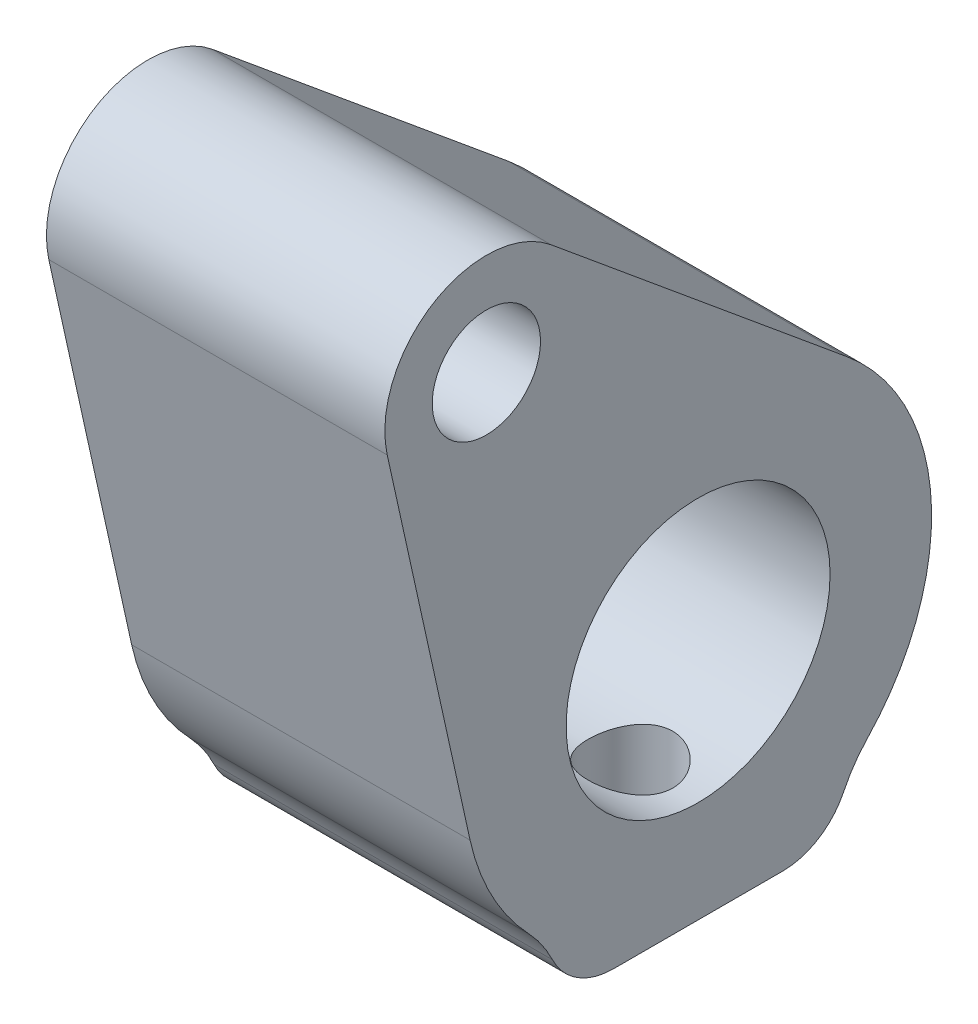
ISO-10303-21;
HEADER;
FILE_DESCRIPTION(('STEP AP214'),'2;1');
FILE_NAME('part.step','',(''),(''),'','','');
FILE_SCHEMA(('AUTOMOTIVE_DESIGN { 1 0 10303 214 1 1 1 1 }'));
ENDSEC;
DATA;
#1=APPLICATION_CONTEXT('core data for automotive mechanical design processes');
#2=APPLICATION_PROTOCOL_DEFINITION('international standard','automotive_design',2000,#1);
#3=PRODUCT_CONTEXT('',#1,'mechanical');
#4=PRODUCT('Part','Part','',(#3));
#5=PRODUCT_RELATED_PRODUCT_CATEGORY('part','',(#4));
#6=PRODUCT_DEFINITION_FORMATION('','',#4);
#7=PRODUCT_DEFINITION_CONTEXT('part definition',#1,'design');
#8=PRODUCT_DEFINITION('design','',#6,#7);
#9=PRODUCT_DEFINITION_SHAPE('','',#8);
#10=(LENGTH_UNIT() NAMED_UNIT(*) SI_UNIT(.MILLI.,.METRE.));
#11=(NAMED_UNIT(*) PLANE_ANGLE_UNIT() SI_UNIT($,.RADIAN.));
#12=(NAMED_UNIT(*) SI_UNIT($,.STERADIAN.) SOLID_ANGLE_UNIT());
#13=UNCERTAINTY_MEASURE_WITH_UNIT(LENGTH_MEASURE(1.E-05),#10,'distance_accuracy_value','');
#14=(GEOMETRIC_REPRESENTATION_CONTEXT(3) GLOBAL_UNCERTAINTY_ASSIGNED_CONTEXT((#13)) GLOBAL_UNIT_ASSIGNED_CONTEXT((#10,
#11,#12)) REPRESENTATION_CONTEXT('',''));
#15=CARTESIAN_POINT('',(0.,0.,0.));
#16=DIRECTION('',(0.,0.,1.));
#17=DIRECTION('',(1.,0.,0.));
#18=AXIS2_PLACEMENT_3D('',#15,#16,#17);
#19=CARTESIAN_POINT('',(4.,5.31578022126978,-4.39914544419221));
#20=DIRECTION('',(0.,0.770402930618808,-0.637557310752494));
#21=DIRECTION('',(0.,0.637557310752494,0.770402930618808));
#22=AXIS2_PLACEMENT_3D('',#19,#20,#21);
#23=PLANE('',#22);
#24=DIRECTION('',(-1.,0.,0.));
#25=VECTOR('',#24,1.);
#26=CARTESIAN_POINT('',(4.,5.31578022126979,-4.39914544419221));
#27=LINE('',#26,#25);
#28=CARTESIAN_POINT('',(4.,5.31578022126979,-4.39914544419221));
#29=VERTEX_POINT('',#28);
#30=CARTESIAN_POINT('',(-6.00000000000001,5.31578022126979,-4.39914544419221));
#31=VERTEX_POINT('',#30);
#32=EDGE_CURVE('E142',#29,#31,#27,.T.);
#33=ORIENTED_EDGE('',*,*,#32,.T.);
#34=DIRECTION('',(0.,-0.637557310752494,-0.770402930618808));
#35=VECTOR('',#34,1.);
#36=CARTESIAN_POINT('',(-6.00000000000001,5.31578022126978,-4.39914544419221));
#37=LINE('',#36,#35);
#38=CARTESIAN_POINT('',(-6.00000000000001,12.5511428384146,4.34382474896435));
#39=VERTEX_POINT('',#38);
#40=EDGE_CURVE('E137',#39,#31,#37,.T.);
#41=ORIENTED_EDGE('',*,*,#40,.F.);
#42=DIRECTION('',(-1.,0.,0.));
#43=VECTOR('',#42,1.);
#44=CARTESIAN_POINT('',(4.,12.5511428384146,4.34382474896435));
#45=LINE('',#44,#43);
#46=CARTESIAN_POINT('',(4.,12.5511428384146,4.34382474896435));
#47=VERTEX_POINT('',#46);
#48=EDGE_CURVE('E11',#47,#39,#45,.T.);
#49=ORIENTED_EDGE('',*,*,#48,.F.);
#50=DIRECTION('',(0.,-0.637557310752494,-0.770402930618808));
#51=VECTOR('',#50,1.);
#52=CARTESIAN_POINT('',(4.,5.31578022126978,-4.39914544419221));
#53=LINE('',#52,#51);
#54=EDGE_CURVE('E284',#47,#29,#53,.T.);
#55=ORIENTED_EDGE('',*,*,#54,.T.);
#56=EDGE_LOOP('',(#33,#41,#49,#55));
#57=FACE_BOUND('',#56,.T.);
#58=ADVANCED_FACE('F45',(#57),#23,.T.);
#59=CARTESIAN_POINT('',(4.,10.2399340465581,6.25649668122183));
#60=DIRECTION('',(-1.,0.,0.));
#61=DIRECTION('',(0.,0.,1.));
#62=AXIS2_PLACEMENT_3D('',#59,#60,#61);
#63=CYLINDRICAL_SURFACE('',#62,3.);
#64=ORIENTED_EDGE('',*,*,#48,.T.);
#65=CARTESIAN_POINT('',(-6.00000000000001,10.2399340465581,6.25649668122183));
#66=DIRECTION('',(1.,0.,0.));
#67=DIRECTION('',(0.,0.,-1.));
#68=AXIS2_PLACEMENT_3D('',#65,#66,#67);
#69=CIRCLE('',#68,3.);
#70=CARTESIAN_POINT('',(-6.00000000000001,9.59271453726741,9.18584932417786));
#71=VERTEX_POINT('',#70);
#72=EDGE_CURVE('E126',#39,#71,#69,.T.);
#73=ORIENTED_EDGE('',*,*,#72,.T.);
#74=DIRECTION('',(-1.,0.,0.));
#75=VECTOR('',#74,1.);
#76=CARTESIAN_POINT('',(4.,9.59271453726741,9.18584932417786));
#77=LINE('',#76,#75);
#78=CARTESIAN_POINT('',(4.,9.59271453726741,9.18584932417786));
#79=VERTEX_POINT('',#78);
#80=EDGE_CURVE('E53',#79,#71,#77,.T.);
#81=ORIENTED_EDGE('',*,*,#80,.F.);
#82=CARTESIAN_POINT('',(4.,10.2399340465581,6.25649668122183));
#83=DIRECTION('',(1.,0.,0.));
#84=DIRECTION('',(0.,0.,-1.));
#85=AXIS2_PLACEMENT_3D('',#82,#83,#84);
#86=CIRCLE('',#85,3.);
#87=EDGE_CURVE('E128',#47,#79,#86,.T.);
#88=ORIENTED_EDGE('',*,*,#87,.F.);
#89=EDGE_LOOP('',(#64,#73,#81,#88));
#90=FACE_BOUND('',#89,.T.);
#91=ADVANCED_FACE('F124',(#90),#63,.T.);
#92=CARTESIAN_POINT('',(4.,-1.48860487136868,6.73751107879886));
#93=DIRECTION('',(0.,0.215739836430243,-0.976450880985343));
#94=DIRECTION('',(0.,0.976450880985343,0.215739836430243));
#95=AXIS2_PLACEMENT_3D('',#92,#93,#94);
#96=PLANE('',#95);
#97=ORIENTED_EDGE('',*,*,#80,.T.);
#98=DIRECTION('',(0.,-0.976450880985343,-0.215739836430243));
#99=VECTOR('',#98,1.);
#100=CARTESIAN_POINT('',(-6.00000000000001,-1.48860487136868,6.73751107879886));
#101=LINE('',#100,#99);
#102=CARTESIAN_POINT('',(-6.00000000000001,-1.48860487136866,6.73751107879887));
#103=VERTEX_POINT('',#102);
#104=EDGE_CURVE('E140',#71,#103,#101,.T.);
#105=ORIENTED_EDGE('',*,*,#104,.T.);
#106=DIRECTION('',(-1.,0.,0.));
#107=VECTOR('',#106,1.);
#108=CARTESIAN_POINT('',(4.,-1.48860487136866,6.73751107879887));
#109=LINE('',#108,#107);
#110=CARTESIAN_POINT('',(4.,-1.48860487136866,6.73751107879887));
#111=VERTEX_POINT('',#110);
#112=EDGE_CURVE('E278',#111,#103,#109,.T.);
#113=ORIENTED_EDGE('',*,*,#112,.F.);
#114=DIRECTION('',(0.,-0.976450880985343,-0.215739836430243));
#115=VECTOR('',#114,1.);
#116=CARTESIAN_POINT('',(4.,-1.48860487136868,6.73751107879886));
#117=LINE('',#116,#115);
#118=EDGE_CURVE('E281',#79,#111,#117,.T.);
#119=ORIENTED_EDGE('',*,*,#118,.F.);
#120=EDGE_LOOP('',(#97,#105,#113,#119));
#121=FACE_BOUND('',#120,.T.);
#122=ADVANCED_FACE('F226',(#121),#96,.F.);
#123=CARTESIAN_POINT('',(4.,0.,0.));
#124=DIRECTION('',(-1.,0.,0.));
#125=DIRECTION('',(0.,0.,1.));
#126=AXIS2_PLACEMENT_3D('',#123,#124,#125);
#127=CYLINDRICAL_SURFACE('',#126,6.9);
#128=ORIENTED_EDGE('',*,*,#112,.T.);
#129=CARTESIAN_POINT('',(-6.00000000000001,0.,0.));
#130=DIRECTION('',(1.,0.,0.));
#131=DIRECTION('',(0.,0.,-1.));
#132=AXIS2_PLACEMENT_3D('',#129,#130,#131);
#133=CIRCLE('',#132,6.9);
#134=CARTESIAN_POINT('',(-6.00000000000001,-4.75053092359995,5.00424379341379));
#135=VERTEX_POINT('',#134);
#136=EDGE_CURVE('E152',#103,#135,#133,.T.);
#137=ORIENTED_EDGE('',*,*,#136,.T.);
#138=DIRECTION('',(-1.,0.,0.));
#139=VECTOR('',#138,1.);
#140=CARTESIAN_POINT('',(4.,-4.75053092359995,5.00424379341379));
#141=LINE('',#140,#139);
#142=CARTESIAN_POINT('',(4.,-4.75053092359995,5.00424379341379));
#143=VERTEX_POINT('',#142);
#144=EDGE_CURVE('E276',#143,#135,#141,.T.);
#145=ORIENTED_EDGE('',*,*,#144,.F.);
#146=CARTESIAN_POINT('',(4.,0.,0.));
#147=DIRECTION('',(1.,0.,0.));
#148=DIRECTION('',(0.,0.,-1.));
#149=AXIS2_PLACEMENT_3D('',#146,#147,#148);
#150=CIRCLE('',#149,6.9);
#151=EDGE_CURVE('E282',#111,#143,#150,.T.);
#152=ORIENTED_EDGE('',*,*,#151,.F.);
#153=EDGE_LOOP('',(#128,#137,#145,#152));
#154=FACE_BOUND('',#153,.T.);
#155=ADVANCED_FACE('F231',(#154),#127,.T.);
#156=CARTESIAN_POINT('',(4.,-7.50446189380283,7.90525468814642));
#157=DIRECTION('',(-1.,0.,0.));
#158=DIRECTION('',(0.,0.,1.));
#159=AXIS2_PLACEMENT_3D('',#156,#157,#158);
#160=CYLINDRICAL_SURFACE('',#159,4.);
#161=ORIENTED_EDGE('',*,*,#144,.T.);
#162=CARTESIAN_POINT('',(-6.00000000000001,-7.50446189380283,7.90525468814642));
#163=DIRECTION('',(1.,0.,0.));
#164=DIRECTION('',(0.,0.,-1.));
#165=AXIS2_PLACEMENT_3D('',#162,#163,#164);
#166=CIRCLE('',#165,4.);
#167=CARTESIAN_POINT('',(-6.00000000000001,-5.76815396460093,4.30175156271547));
#168=VERTEX_POINT('',#167);
#169=EDGE_CURVE('E155',#168,#135,#166,.T.);
#170=ORIENTED_EDGE('',*,*,#169,.F.);
#171=DIRECTION('',(-1.,0.,0.));
#172=VECTOR('',#171,1.);
#173=CARTESIAN_POINT('',(4.,-5.76815396460093,4.30175156271547));
#174=LINE('',#173,#172);
#175=CARTESIAN_POINT('',(4.,-5.76815396460093,4.30175156271547));
#176=VERTEX_POINT('',#175);
#177=EDGE_CURVE('E274',#176,#168,#174,.T.);
#178=ORIENTED_EDGE('',*,*,#177,.F.);
#179=CARTESIAN_POINT('',(4.,-7.50446189380283,7.90525468814642));
#180=DIRECTION('',(1.,0.,0.));
#181=DIRECTION('',(0.,0.,-1.));
#182=AXIS2_PLACEMENT_3D('',#179,#180,#181);
#183=CIRCLE('',#182,4.);
#184=EDGE_CURVE('E290',#176,#143,#183,.T.);
#185=ORIENTED_EDGE('',*,*,#184,.T.);
#186=EDGE_LOOP('',(#161,#170,#178,#185));
#187=FACE_BOUND('',#186,.T.);
#188=ADVANCED_FACE('F235',(#187),#160,.F.);
#189=CARTESIAN_POINT('',(4.,-4.89999999999999,2.5));
#190=DIRECTION('',(-1.,0.,0.));
#191=DIRECTION('',(0.,0.,1.));
#192=AXIS2_PLACEMENT_3D('',#189,#190,#191);
#193=CYLINDRICAL_SURFACE('',#192,2.);
#194=ORIENTED_EDGE('',*,*,#177,.T.);
#195=CARTESIAN_POINT('',(-6.00000000000001,-4.89999999999999,2.5));
#196=DIRECTION('',(1.,0.,0.));
#197=DIRECTION('',(0.,0.,-1.));
#198=AXIS2_PLACEMENT_3D('',#195,#196,#197);
#199=CIRCLE('',#198,2.);
#200=CARTESIAN_POINT('',(-6.00000000000001,-6.89999999999999,2.5));
#201=VERTEX_POINT('',#200);
#202=EDGE_CURVE('E158',#168,#201,#199,.T.);
#203=ORIENTED_EDGE('',*,*,#202,.T.);
#204=DIRECTION('',(-1.,0.,0.));
#205=VECTOR('',#204,1.);
#206=CARTESIAN_POINT('',(4.,-6.89999999999999,2.5));
#207=LINE('',#206,#205);
#208=CARTESIAN_POINT('',(4.,-6.89999999999999,2.5));
#209=VERTEX_POINT('',#208);
#210=EDGE_CURVE('E269',#209,#201,#207,.T.);
#211=ORIENTED_EDGE('',*,*,#210,.F.);
#212=CARTESIAN_POINT('',(4.,-4.89999999999999,2.5));
#213=DIRECTION('',(1.,0.,0.));
#214=DIRECTION('',(0.,0.,-1.));
#215=AXIS2_PLACEMENT_3D('',#212,#213,#214);
#216=CIRCLE('',#215,2.);
#217=EDGE_CURVE('E293',#176,#209,#216,.T.);
#218=ORIENTED_EDGE('',*,*,#217,.F.);
#219=EDGE_LOOP('',(#194,#203,#211,#218));
#220=FACE_BOUND('',#219,.T.);
#221=ADVANCED_FACE('F239',(#220),#193,.T.);
#222=CARTESIAN_POINT('',(4.,-6.89999999999999,0.));
#223=DIRECTION('',(0.,-1.,0.));
#224=DIRECTION('',(0.,0.,-1.));
#225=AXIS2_PLACEMENT_3D('',#222,#223,#224);
#226=PLANE('',#225);
#227=CARTESIAN_POINT('',(2.,-6.89999999999999,0.));
#228=DIRECTION('',(0.,-1.,0.));
#229=DIRECTION('',(0.,0.,-1.));
#230=AXIS2_PLACEMENT_3D('',#227,#228,#229);
#231=CIRCLE('',#230,1.25);
#232=CARTESIAN_POINT('',(2.,-6.89999999999999,-1.25));
#233=VERTEX_POINT('',#232);
#234=EDGE_CURVE('E172',#233,#233,#231,.T.);
#235=ORIENTED_EDGE('',*,*,#234,.F.);
#236=EDGE_LOOP('',(#235));
#237=FACE_BOUND('',#236,.T.);
#238=ORIENTED_EDGE('',*,*,#210,.T.);
#239=DIRECTION('',(0.,0.,1.));
#240=VECTOR('',#239,1.);
#241=CARTESIAN_POINT('',(-6.00000000000001,-6.89999999999999,0.));
#242=LINE('',#241,#240);
#243=CARTESIAN_POINT('',(-6.00000000000001,-6.89999999999999,-2.5));
#244=VERTEX_POINT('',#243);
#245=EDGE_CURVE('E161',#244,#201,#242,.T.);
#246=ORIENTED_EDGE('',*,*,#245,.F.);
#247=DIRECTION('',(-1.,0.,0.));
#248=VECTOR('',#247,1.);
#249=CARTESIAN_POINT('',(4.,-6.89999999999999,-2.5));
#250=LINE('',#249,#248);
#251=CARTESIAN_POINT('',(4.,-6.89999999999999,-2.5));
#252=VERTEX_POINT('',#251);
#253=EDGE_CURVE('E267',#252,#244,#250,.T.);
#254=ORIENTED_EDGE('',*,*,#253,.F.);
#255=DIRECTION('',(0.,0.,1.));
#256=VECTOR('',#255,1.);
#257=CARTESIAN_POINT('',(4.,-6.89999999999999,0.));
#258=LINE('',#257,#256);
#259=EDGE_CURVE('E295',#252,#209,#258,.T.);
#260=ORIENTED_EDGE('',*,*,#259,.T.);
#261=EDGE_LOOP('',(#238,#246,#254,#260));
#262=FACE_BOUND('',#261,.T.);
#263=CARTESIAN_POINT('',(-4.,-6.89999999999999,0.));
#264=DIRECTION('',(0.,1.,0.));
#265=DIRECTION('',(0.,0.,-1.));
#266=AXIS2_PLACEMENT_3D('',#263,#264,#265);
#267=CIRCLE('',#266,1.25);
#268=CARTESIAN_POINT('',(-4.,-6.89999999999999,-1.25));
#269=VERTEX_POINT('',#268);
#270=EDGE_CURVE('E207',#269,#269,#267,.T.);
#271=ORIENTED_EDGE('',*,*,#270,.T.);
#272=EDGE_LOOP('',(#271));
#273=FACE_BOUND('',#272,.T.);
#274=ADVANCED_FACE('F243',(#237,#262,#273),#226,.T.);
#275=CARTESIAN_POINT('',(4.,-4.89999999999999,-2.5));
#276=DIRECTION('',(-1.,0.,0.));
#277=DIRECTION('',(0.,0.,1.));
#278=AXIS2_PLACEMENT_3D('',#275,#276,#277);
#279=CYLINDRICAL_SURFACE('',#278,2.);
#280=ORIENTED_EDGE('',*,*,#253,.T.);
#281=CARTESIAN_POINT('',(-6.00000000000001,-4.89999999999999,-2.5));
#282=DIRECTION('',(1.,0.,0.));
#283=DIRECTION('',(0.,0.,-1.));
#284=AXIS2_PLACEMENT_3D('',#281,#282,#283);
#285=CIRCLE('',#284,2.);
#286=CARTESIAN_POINT('',(-6.00000000000001,-5.76815396460093,-4.30175156271547));
#287=VERTEX_POINT('',#286);
#288=EDGE_CURVE('E164',#244,#287,#285,.T.);
#289=ORIENTED_EDGE('',*,*,#288,.T.);
#290=DIRECTION('',(-1.,0.,0.));
#291=VECTOR('',#290,1.);
#292=CARTESIAN_POINT('',(4.,-5.76815396460093,-4.30175156271547));
#293=LINE('',#292,#291);
#294=CARTESIAN_POINT('',(4.,-5.76815396460093,-4.30175156271547));
#295=VERTEX_POINT('',#294);
#296=EDGE_CURVE('E261',#295,#287,#293,.T.);
#297=ORIENTED_EDGE('',*,*,#296,.F.);
#298=CARTESIAN_POINT('',(4.,-4.89999999999999,-2.5));
#299=DIRECTION('',(1.,0.,0.));
#300=DIRECTION('',(0.,0.,-1.));
#301=AXIS2_PLACEMENT_3D('',#298,#299,#300);
#302=CIRCLE('',#301,2.);
#303=EDGE_CURVE('E298',#252,#295,#302,.T.);
#304=ORIENTED_EDGE('',*,*,#303,.F.);
#305=EDGE_LOOP('',(#280,#289,#297,#304));
#306=FACE_BOUND('',#305,.T.);
#307=ADVANCED_FACE('F247',(#306),#279,.T.);
#308=CARTESIAN_POINT('',(4.,-7.50446189380283,-7.90525468814642));
#309=DIRECTION('',(-1.,0.,0.));
#310=DIRECTION('',(0.,0.,1.));
#311=AXIS2_PLACEMENT_3D('',#308,#309,#310);
#312=CYLINDRICAL_SURFACE('',#311,4.);
#313=ORIENTED_EDGE('',*,*,#296,.T.);
#314=CARTESIAN_POINT('',(-6.00000000000001,-7.50446189380283,-7.90525468814642));
#315=DIRECTION('',(1.,0.,0.));
#316=DIRECTION('',(0.,0.,-1.));
#317=AXIS2_PLACEMENT_3D('',#314,#315,#316);
#318=CIRCLE('',#317,4.);
#319=CARTESIAN_POINT('',(-6.00000000000001,-4.75053092359995,-5.00424379341379));
#320=VERTEX_POINT('',#319);
#321=EDGE_CURVE('E167',#320,#287,#318,.T.);
#322=ORIENTED_EDGE('',*,*,#321,.F.);
#323=DIRECTION('',(-1.,0.,0.));
#324=VECTOR('',#323,1.);
#325=CARTESIAN_POINT('',(4.,-4.75053092359995,-5.00424379341379));
#326=LINE('',#325,#324);
#327=CARTESIAN_POINT('',(4.,-4.75053092359995,-5.00424379341379));
#328=VERTEX_POINT('',#327);
#329=EDGE_CURVE('E68',#328,#320,#326,.T.);
#330=ORIENTED_EDGE('',*,*,#329,.F.);
#331=CARTESIAN_POINT('',(4.,-7.50446189380283,-7.90525468814642));
#332=DIRECTION('',(1.,0.,0.));
#333=DIRECTION('',(0.,0.,-1.));
#334=AXIS2_PLACEMENT_3D('',#331,#332,#333);
#335=CIRCLE('',#334,4.);
#336=EDGE_CURVE('E265',#328,#295,#335,.T.);
#337=ORIENTED_EDGE('',*,*,#336,.T.);
#338=EDGE_LOOP('',(#313,#322,#330,#337));
#339=FACE_BOUND('',#338,.T.);
#340=ADVANCED_FACE('F251',(#339),#312,.F.);
#341=CARTESIAN_POINT('',(4.,0.,0.));
#342=DIRECTION('',(-1.,0.,0.));
#343=DIRECTION('',(0.,0.,1.));
#344=AXIS2_PLACEMENT_3D('',#341,#342,#343);
#345=CYLINDRICAL_SURFACE('',#344,3.89999999999998);
#346=CARTESIAN_POINT('',(2.,-3.69425229241314,-1.25));
#347=CARTESIAN_POINT('',(1.93175151395146,-3.69425249202971,-1.24999981851575));
#348=CARTESIAN_POINT('',(1.86350082416973,-3.6961642360412,-1.2443916233223));
#349=CARTESIAN_POINT('',(1.72901095230617,-3.70356864087387,-1.22217549490069));
#350=CARTESIAN_POINT('',(1.66277223529954,-3.70906212313334,-1.20556503839254));
#351=CARTESIAN_POINT('',(1.53427467861068,-3.72294525499142,-1.16197933309358));
#352=CARTESIAN_POINT('',(1.47200875769221,-3.73132957068705,-1.13502316298145));
#353=CARTESIAN_POINT('',(1.35286465422038,-3.75004212816711,-1.07157546452978));
#354=CARTESIAN_POINT('',(1.29598751851594,-3.76037074650098,-1.03508208860502));
#355=CARTESIAN_POINT('',(1.18717947689042,-3.78222689234484,-0.952182987490364));
#356=CARTESIAN_POINT('',(1.13547194229388,-3.79378262878734,-0.905491446550827));
#357=CARTESIAN_POINT('',(1.04047040871634,-3.8165515495269,-0.804132399041334));
#358=CARTESIAN_POINT('',(0.997177649143396,-3.82776468315749,-0.749463719595493));
#359=CARTESIAN_POINT('',(0.919238428719584,-3.84890914098063,-0.6320863912879));
#360=CARTESIAN_POINT('',(0.884823517954164,-3.85880339530638,-0.569216726207731));
#361=CARTESIAN_POINT('',(0.827144279454016,-3.87586475293543,-0.438210016336601));
#362=CARTESIAN_POINT('',(0.803877186649212,-3.88303253241406,-0.370074282599241));
#363=CARTESIAN_POINT('',(0.769904264152343,-3.89363360596543,-0.232809588964288));
#364=CARTESIAN_POINT('',(0.758816324745988,-3.89718023968881,-0.163784115542597));
#365=CARTESIAN_POINT('',(0.748304153683394,-3.90054047280189,-0.024767448109535));
#366=CARTESIAN_POINT('',(0.748877136992656,-3.90035496355744,0.045223511319567));
#367=CARTESIAN_POINT('',(0.761422574082255,-3.89634993455905,0.181489272974408));
#368=CARTESIAN_POINT('',(0.772980503930117,-3.89266256367312,0.247806749120399));
#369=CARTESIAN_POINT('',(0.806485575334514,-3.88223193478103,0.377505603811683));
#370=CARTESIAN_POINT('',(0.828433405569724,-3.8754884742079,0.44088678742353));
#371=CARTESIAN_POINT('',(0.882352311643508,-3.85952943086421,0.563851339596195));
#372=CARTESIAN_POINT('',(0.914446199323784,-3.85028376912296,0.623376791362474));
#373=CARTESIAN_POINT('',(0.987646689603186,-3.83029005373224,0.736323820787954));
#374=CARTESIAN_POINT('',(1.02875566001805,-3.81954160564455,0.789743789221269));
#375=CARTESIAN_POINT('',(1.12093290737946,-3.79712755134543,0.891433224785216));
#376=CARTESIAN_POINT('',(1.17235806771017,-3.78544239211941,0.939375341649817));
#377=CARTESIAN_POINT('',(1.28262410815424,-3.76287398163305,1.02605588920971));
#378=CARTESIAN_POINT('',(1.34146595735216,-3.75199083546092,1.06479311525727));
#379=CARTESIAN_POINT('',(1.46586215468306,-3.73215680168478,1.13237198149314));
#380=CARTESIAN_POINT('',(1.53149015914895,-3.72323132519094,1.16108605617738));
#381=CARTESIAN_POINT('',(1.66700608512577,-3.70861960716111,1.20694936015077));
#382=CARTESIAN_POINT('',(1.73689236996988,-3.70293212968844,1.22410300249));
#383=CARTESIAN_POINT('',(1.87579147462505,-3.69571672749005,1.2457138435188));
#384=CARTESIAN_POINT('',(1.9447174011293,-3.69402391384122,1.25067470765079));
#385=CARTESIAN_POINT('',(2.08242371120065,-3.69453052117417,1.2491779601229));
#386=CARTESIAN_POINT('',(2.15120411684463,-3.696729301922,1.24272222668904));
#387=CARTESIAN_POINT('',(2.28445279434657,-3.7046079478478,1.21902662181362));
#388=CARTESIAN_POINT('',(2.34898864038109,-3.71017805972426,1.20212641747613));
#389=CARTESIAN_POINT('',(2.4742993511313,-3.72405378497113,1.15842370562716));
#390=CARTESIAN_POINT('',(2.53507357973844,-3.73235985951349,1.13161952861618));
#391=CARTESIAN_POINT('',(2.65314479326899,-3.75107916788835,1.06795793621505));
#392=CARTESIAN_POINT('',(2.71028380865813,-3.76154790465225,1.03082428789276));
#393=CARTESIAN_POINT('',(2.81770255134469,-3.78330082236314,0.947876721589605));
#394=CARTESIAN_POINT('',(2.86798039877949,-3.79458522550087,0.902060432869076));
#395=CARTESIAN_POINT('',(2.96252993099659,-3.81729784462756,0.80065524022365));
#396=CARTESIAN_POINT('',(3.00644069360977,-3.82871059767068,0.744725419938513));
#397=CARTESIAN_POINT('',(3.08427116878891,-3.8499010015929,0.626013033800023));
#398=CARTESIAN_POINT('',(3.11819130555264,-3.85967872188718,0.563230759054181));
#399=CARTESIAN_POINT('',(3.17475630045196,-3.87644490225488,0.432957757819251));
#400=CARTESIAN_POINT('',(3.19748022931075,-3.88345285148581,0.36550400330302));
#401=CARTESIAN_POINT('',(3.231179133329,-3.89397514902178,0.227466234410033));
#402=CARTESIAN_POINT('',(3.24215799628413,-3.89749065335176,0.156883263913435));
#403=CARTESIAN_POINT('',(3.2517262520046,-3.90055130994382,0.0179048017391957));
#404=CARTESIAN_POINT('',(3.25083571503404,-3.90026313020788,-0.0504516246244394));
#405=CARTESIAN_POINT('',(3.23795764782758,-3.8961522257819,-0.185996249288454));
#406=CARTESIAN_POINT('',(3.22597090608865,-3.89232975223901,-0.253184530251702));
#407=CARTESIAN_POINT('',(3.19157739879571,-3.8816357529062,-0.383573670237894));
#408=CARTESIAN_POINT('',(3.16931606942112,-3.87480684334712,-0.44681663254306));
#409=CARTESIAN_POINT('',(3.11513779436898,-3.85880353325986,-0.568698283629704));
#410=CARTESIAN_POINT('',(3.08321915392453,-3.84962872109174,-0.627336161985586));
#411=CARTESIAN_POINT('',(3.00933831657355,-3.82948551420838,-0.740585139439058));
#412=CARTESIAN_POINT('',(2.9670628137699,-3.81846545330558,-0.794982550555972));
#413=CARTESIAN_POINT('',(2.87421336231854,-3.79601404030006,-0.896082807341883));
#414=CARTESIAN_POINT('',(2.82363686845551,-3.78458256289247,-0.942783284179302));
#415=CARTESIAN_POINT('',(2.71347850463268,-3.76212006275802,-1.02883588187026));
#416=CARTESIAN_POINT('',(2.65364135683672,-3.75111751216286,-1.06786960701199));
#417=CARTESIAN_POINT('',(2.52792071387835,-3.73126773095979,-1.13528973262009));
#418=CARTESIAN_POINT('',(2.46203935706379,-3.72241974211853,-1.16367988067736));
#419=CARTESIAN_POINT('',(2.33084265479791,-3.70850477123848,-1.20726155864073));
#420=CARTESIAN_POINT('',(2.26581191921874,-3.70321605996955,-1.22323938191069));
#421=CARTESIAN_POINT('',(2.13385447044529,-3.69609020716365,-1.24460720539302));
#422=CARTESIAN_POINT('',(2.06692829487277,-3.69425209665794,-1.25000017797363));
#423=CARTESIAN_POINT('',(2.,-3.69425229241314,-1.25));
#424=B_SPLINE_CURVE_WITH_KNOTS('',3,(#346,#347,#348,#349,#350,#351,#352,#353,#354,#355,#356,
#357,#358,#359,#360,#361,#362,#363,#364,#365,#366,#367,#368,#369,#370,#371,#372,#373,#374,#375,
#376,#377,#378,#379,#380,#381,#382,#383,#384,#385,#386,#387,#388,#389,#390,#391,#392,#393,#394,
#395,#396,#397,#398,#399,#400,#401,#402,#403,#404,#405,#406,#407,#408,#409,#410,#411,#412,#413,
#414,#415,#416,#417,#418,#419,#420,#421,#422,#423),.UNSPECIFIED.,.T.,.F.,(4,2,2,2,2,2,2,2,2,2,2,
2,2,2,2,2,2,2,2,2,2,2,2,2,2,2,2,2,2,2,2,2,2,2,2,2,2,2,4),(0.,0.204497997350409,
0.409042910915257,0.613212418766928,0.817421508500114,1.02832734526817,1.23926422275183,
1.45524592223191,1.67117402251439,1.88011484899977,2.08900577372408,2.29031453958058,
2.49163665074981,2.69549549247218,2.8994079420814,3.11223671809477,3.32509333177384,
3.54056787074111,3.75596010834278,3.96229297592139,4.16859190136354,4.36851114950394,
4.56846411315163,4.77438630887384,4.9803648115616,5.19539279949904,5.41041165612199,
5.62388941003611,5.83729647767696,6.0413848138847,6.24545864867632,6.44672846903434,
6.64803363085209,6.85640721353114,7.06484480661963,7.28065601809826,7.49639117118007,
7.6969897206886,7.89753193136598),.UNSPECIFIED.);
#425=CARTESIAN_POINT('',(2.,-3.69425229241314,-1.25));
#426=VERTEX_POINT('',#425);
#427=EDGE_CURVE('E175',#426,#426,#424,.T.);
#428=ORIENTED_EDGE('',*,*,#427,.F.);
#429=EDGE_LOOP('',(#428));
#430=FACE_BOUND('',#429,.T.);
#431=CARTESIAN_POINT('',(4.,0.,0.));
#432=DIRECTION('',(1.,0.,0.));
#433=DIRECTION('',(0.,0.,-1.));
#434=AXIS2_PLACEMENT_3D('',#431,#432,#433);
#435=CIRCLE('',#434,3.89999999999998);
#436=CARTESIAN_POINT('',(4.,0.,-3.89999999999998));
#437=VERTEX_POINT('',#436);
#438=EDGE_CURVE('E286',#437,#437,#435,.T.);
#439=ORIENTED_EDGE('',*,*,#438,.T.);
#440=EDGE_LOOP('',(#439));
#441=FACE_BOUND('',#440,.T.);
#442=CARTESIAN_POINT('',(-4.,-3.69425229241314,-1.25));
#443=CARTESIAN_POINT('',(-3.93175151395146,-3.69425249202971,-1.24999981851575));
#444=CARTESIAN_POINT('',(-3.86350082416973,-3.6961642360412,-1.2443916233223));
#445=CARTESIAN_POINT('',(-3.72901095230617,-3.70356864087387,-1.22217549490069));
#446=CARTESIAN_POINT('',(-3.66277223529954,-3.70906212313334,-1.20556503839254));
#447=CARTESIAN_POINT('',(-3.53427467861068,-3.72294525499142,-1.16197933309358));
#448=CARTESIAN_POINT('',(-3.47200875769221,-3.73132957068705,-1.13502316298145));
#449=CARTESIAN_POINT('',(-3.35286465422038,-3.75004212816711,-1.07157546452978));
#450=CARTESIAN_POINT('',(-3.29598751851595,-3.76037074650098,-1.03508208860502));
#451=CARTESIAN_POINT('',(-3.18717947689042,-3.78222689234484,-0.952182987490365));
#452=CARTESIAN_POINT('',(-3.13547194229388,-3.79378262878734,-0.905491446550827));
#453=CARTESIAN_POINT('',(-3.04047040871634,-3.8165515495269,-0.804132399041334));
#454=CARTESIAN_POINT('',(-2.9971776491434,-3.82776468315749,-0.749463719595493));
#455=CARTESIAN_POINT('',(-2.91923842871959,-3.84890914098063,-0.6320863912879));
#456=CARTESIAN_POINT('',(-2.88482351795417,-3.85880339530638,-0.569216726207731));
#457=CARTESIAN_POINT('',(-2.82714427945402,-3.87586475293543,-0.438210016336601));
#458=CARTESIAN_POINT('',(-2.80387718664921,-3.88303253241406,-0.370074282599241));
#459=CARTESIAN_POINT('',(-2.76990426415235,-3.89363360596543,-0.232809588964288));
#460=CARTESIAN_POINT('',(-2.75881632474599,-3.89718023968881,-0.163784115542597));
#461=CARTESIAN_POINT('',(-2.7483041536834,-3.90054047280189,-0.0247674481095351));
#462=CARTESIAN_POINT('',(-2.74887713699266,-3.90035496355744,0.045223511319567));
#463=CARTESIAN_POINT('',(-2.76142257408226,-3.89634993455905,0.181489272974408));
#464=CARTESIAN_POINT('',(-2.77298050393012,-3.89266256367312,0.247806749120399));
#465=CARTESIAN_POINT('',(-2.80648557533452,-3.88223193478103,0.377505603811683));
#466=CARTESIAN_POINT('',(-2.82843340556973,-3.8754884742079,0.44088678742353));
#467=CARTESIAN_POINT('',(-2.88235231164351,-3.85952943086421,0.563851339596195));
#468=CARTESIAN_POINT('',(-2.91444619932379,-3.85028376912296,0.623376791362474));
#469=CARTESIAN_POINT('',(-2.98764668960319,-3.83029005373224,0.736323820787954));
#470=CARTESIAN_POINT('',(-3.02875566001805,-3.81954160564455,0.78974378922127));
#471=CARTESIAN_POINT('',(-3.12093290737947,-3.79712755134543,0.891433224785216));
#472=CARTESIAN_POINT('',(-3.17235806771018,-3.78544239211941,0.939375341649817));
#473=CARTESIAN_POINT('',(-3.28262410815424,-3.76287398163305,1.02605588920971));
#474=CARTESIAN_POINT('',(-3.34146595735217,-3.75199083546092,1.06479311525727));
#475=CARTESIAN_POINT('',(-3.46586215468306,-3.73215680168478,1.13237198149314));
#476=CARTESIAN_POINT('',(-3.53149015914895,-3.72323132519094,1.16108605617738));
#477=CARTESIAN_POINT('',(-3.66700608512577,-3.70861960716111,1.20694936015077));
#478=CARTESIAN_POINT('',(-3.73689236996988,-3.70293212968844,1.22410300249));
#479=CARTESIAN_POINT('',(-3.87579147462505,-3.69571672749005,1.2457138435188));
#480=CARTESIAN_POINT('',(-3.9447174011293,-3.69402391384122,1.25067470765079));
#481=CARTESIAN_POINT('',(-4.08242371120065,-3.69453052117417,1.2491779601229));
#482=CARTESIAN_POINT('',(-4.15120411684463,-3.696729301922,1.24272222668904));
#483=CARTESIAN_POINT('',(-4.28445279434658,-3.7046079478478,1.21902662181362));
#484=CARTESIAN_POINT('',(-4.3489886403811,-3.71017805972426,1.20212641747613));
#485=CARTESIAN_POINT('',(-4.4742993511313,-3.72405378497113,1.15842370562715));
#486=CARTESIAN_POINT('',(-4.53507357973844,-3.73235985951349,1.13161952861618));
#487=CARTESIAN_POINT('',(-4.653144793269,-3.75107916788835,1.06795793621505));
#488=CARTESIAN_POINT('',(-4.71028380865814,-3.76154790465225,1.03082428789276));
#489=CARTESIAN_POINT('',(-4.81770255134469,-3.78330082236314,0.947876721589605));
#490=CARTESIAN_POINT('',(-4.86798039877949,-3.79458522550087,0.902060432869075));
#491=CARTESIAN_POINT('',(-4.96252993099659,-3.81729784462756,0.80065524022365));
#492=CARTESIAN_POINT('',(-5.00644069360977,-3.82871059767068,0.744725419938514));
#493=CARTESIAN_POINT('',(-5.08427116878891,-3.8499010015929,0.626013033800023));
#494=CARTESIAN_POINT('',(-5.11819130555265,-3.85967872188718,0.563230759054181));
#495=CARTESIAN_POINT('',(-5.17475630045196,-3.87644490225488,0.432957757819251));
#496=CARTESIAN_POINT('',(-5.19748022931075,-3.88345285148581,0.36550400330302));
#497=CARTESIAN_POINT('',(-5.231179133329,-3.89397514902178,0.227466234410033));
#498=CARTESIAN_POINT('',(-5.24215799628413,-3.89749065335176,0.156883263913435));
#499=CARTESIAN_POINT('',(-5.2517262520046,-3.90055130994382,0.0179048017391957));
#500=CARTESIAN_POINT('',(-5.25083571503404,-3.90026313020788,-0.0504516246244394));
#501=CARTESIAN_POINT('',(-5.23795764782759,-3.8961522257819,-0.185996249288454));
#502=CARTESIAN_POINT('',(-5.22597090608865,-3.89232975223901,-0.253184530251702));
#503=CARTESIAN_POINT('',(-5.19157739879571,-3.8816357529062,-0.383573670237894));
#504=CARTESIAN_POINT('',(-5.16931606942112,-3.87480684334712,-0.446816632543061));
#505=CARTESIAN_POINT('',(-5.11513779436898,-3.85880353325986,-0.568698283629704));
#506=CARTESIAN_POINT('',(-5.08321915392453,-3.84962872109174,-0.627336161985586));
#507=CARTESIAN_POINT('',(-5.00933831657355,-3.82948551420838,-0.740585139439058));
#508=CARTESIAN_POINT('',(-4.9670628137699,-3.81846545330558,-0.794982550555972));
#509=CARTESIAN_POINT('',(-4.87421336231854,-3.79601404030006,-0.896082807341883));
#510=CARTESIAN_POINT('',(-4.82363686845551,-3.78458256289247,-0.942783284179302));
#511=CARTESIAN_POINT('',(-4.71347850463268,-3.76212006275802,-1.02883588187026));
#512=CARTESIAN_POINT('',(-4.65364135683672,-3.75111751216286,-1.06786960701199));
#513=CARTESIAN_POINT('',(-4.52792071387836,-3.73126773095979,-1.13528973262009));
#514=CARTESIAN_POINT('',(-4.46203935706379,-3.72241974211853,-1.16367988067736));
#515=CARTESIAN_POINT('',(-4.33084265479791,-3.70850477123848,-1.20726155864073));
#516=CARTESIAN_POINT('',(-4.26581191921874,-3.70321605996955,-1.22323938191069));
#517=CARTESIAN_POINT('',(-4.1338544704453,-3.69609020716365,-1.24460720539302));
#518=CARTESIAN_POINT('',(-4.06692829487277,-3.69425209665794,-1.25000017797363));
#519=CARTESIAN_POINT('',(-4.,-3.69425229241314,-1.25));
#520=B_SPLINE_CURVE_WITH_KNOTS('',3,(#442,#443,#444,#445,#446,#447,#448,#449,#450,#451,#452,
#453,#454,#455,#456,#457,#458,#459,#460,#461,#462,#463,#464,#465,#466,#467,#468,#469,#470,#471,
#472,#473,#474,#475,#476,#477,#478,#479,#480,#481,#482,#483,#484,#485,#486,#487,#488,#489,#490,
#491,#492,#493,#494,#495,#496,#497,#498,#499,#500,#501,#502,#503,#504,#505,#506,#507,#508,#509,
#510,#511,#512,#513,#514,#515,#516,#517,#518,#519),.UNSPECIFIED.,.T.,.F.,(4,2,2,2,2,2,2,2,2,2,2,
2,2,2,2,2,2,2,2,2,2,2,2,2,2,2,2,2,2,2,2,2,2,2,2,2,2,2,4),(0.,0.204497997350408,
0.409042910915257,0.613212418766929,0.817421508500114,1.02832734526817,1.23926422275183,
1.45524592223191,1.67117402251439,1.88011484899977,2.08900577372408,2.29031453958058,
2.49163665074981,2.69549549247218,2.89940794208141,3.11223671809477,3.32509333177384,
3.54056787074111,3.75596010834278,3.96229297592138,4.16859190136354,4.36851114950394,
4.56846411315164,4.77438630887384,4.9803648115616,5.19539279949904,5.41041165612199,
5.62388941003612,5.83729647767696,6.04138481388471,6.24545864867633,6.44672846903434,
6.6480336308521,6.85640721353114,7.06484480661963,7.28065601809826,7.49639117118007,
7.6969897206886,7.89753193136598),.UNSPECIFIED.);
#521=CARTESIAN_POINT('',(-4.,-3.69425229241314,-1.25));
#522=VERTEX_POINT('',#521);
#523=EDGE_CURVE('E201',#522,#522,#520,.T.);
#524=ORIENTED_EDGE('',*,*,#523,.T.);
#525=EDGE_LOOP('',(#524));
#526=FACE_BOUND('',#525,.T.);
#527=CARTESIAN_POINT('',(-6.00000000000001,0.,0.));
#528=DIRECTION('',(1.,0.,0.));
#529=DIRECTION('',(0.,0.,-1.));
#530=AXIS2_PLACEMENT_3D('',#527,#528,#529);
#531=CIRCLE('',#530,3.89999999999998);
#532=CARTESIAN_POINT('',(-6.00000000000001,0.,-3.89999999999998));
#533=VERTEX_POINT('',#532);
#534=EDGE_CURVE('E144',#533,#533,#531,.T.);
#535=ORIENTED_EDGE('',*,*,#534,.F.);
#536=EDGE_LOOP('',(#535));
#537=FACE_BOUND('',#536,.T.);
#538=ADVANCED_FACE('F47',(#430,#441,#526,#537),#345,.F.);
#539=CARTESIAN_POINT('',(4.,0.,0.));
#540=DIRECTION('',(-1.,0.,0.));
#541=DIRECTION('',(0.,0.,1.));
#542=AXIS2_PLACEMENT_3D('',#539,#540,#541);
#543=CYLINDRICAL_SURFACE('',#542,6.9);
#544=ORIENTED_EDGE('',*,*,#329,.T.);
#545=CARTESIAN_POINT('',(-6.00000000000001,0.,0.));
#546=DIRECTION('',(1.,0.,0.));
#547=DIRECTION('',(0.,0.,-1.));
#548=AXIS2_PLACEMENT_3D('',#545,#546,#547);
#549=CIRCLE('',#548,6.9);
#550=EDGE_CURVE('E170',#320,#31,#549,.T.);
#551=ORIENTED_EDGE('',*,*,#550,.T.);
#552=ORIENTED_EDGE('',*,*,#32,.F.);
#553=CARTESIAN_POINT('',(4.,0.,0.));
#554=DIRECTION('',(1.,0.,0.));
#555=DIRECTION('',(0.,0.,-1.));
#556=AXIS2_PLACEMENT_3D('',#553,#554,#555);
#557=CIRCLE('',#556,6.9);
#558=EDGE_CURVE('E60',#328,#29,#557,.T.);
#559=ORIENTED_EDGE('',*,*,#558,.F.);
#560=EDGE_LOOP('',(#544,#551,#552,#559));
#561=FACE_BOUND('',#560,.T.);
#562=ADVANCED_FACE('F218',(#561),#543,.T.);
#563=CARTESIAN_POINT('',(4.,0.,0.));
#564=DIRECTION('',(1.,0.,0.));
#565=DIRECTION('',(0.,0.,-1.));
#566=AXIS2_PLACEMENT_3D('',#563,#564,#565);
#567=PLANE('',#566);
#568=CARTESIAN_POINT('',(4.,10.2399340465581,6.25649668122183));
#569=DIRECTION('',(1.,0.,0.));
#570=DIRECTION('',(0.,0.,-1.));
#571=AXIS2_PLACEMENT_3D('',#568,#569,#570);
#572=CIRCLE('',#571,1.59999999999999);
#573=CARTESIAN_POINT('',(4.,10.2399340465581,4.65649668122183));
#574=VERTEX_POINT('',#573);
#575=EDGE_CURVE('E183',#574,#574,#572,.T.);
#576=ORIENTED_EDGE('',*,*,#575,.F.);
#577=EDGE_LOOP('',(#576));
#578=FACE_BOUND('',#577,.T.);
#579=ORIENTED_EDGE('',*,*,#438,.F.);
#580=EDGE_LOOP('',(#579));
#581=FACE_BOUND('',#580,.T.);
#582=ORIENTED_EDGE('',*,*,#54,.F.);
#583=ORIENTED_EDGE('',*,*,#87,.T.);
#584=ORIENTED_EDGE('',*,*,#118,.T.);
#585=ORIENTED_EDGE('',*,*,#151,.T.);
#586=ORIENTED_EDGE('',*,*,#184,.F.);
#587=ORIENTED_EDGE('',*,*,#217,.T.);
#588=ORIENTED_EDGE('',*,*,#259,.F.);
#589=ORIENTED_EDGE('',*,*,#303,.T.);
#590=ORIENTED_EDGE('',*,*,#336,.F.);
#591=ORIENTED_EDGE('',*,*,#558,.T.);
#592=EDGE_LOOP('',(#582,#583,#584,#585,#586,#587,#588,#589,#590,#591));
#593=FACE_BOUND('',#592,.T.);
#594=ADVANCED_FACE('F213',(#578,#581,#593),#567,.T.);
#595=CARTESIAN_POINT('',(-1.,10.2399340465581,6.25649668122183));
#596=DIRECTION('',(-1.,0.,0.));
#597=DIRECTION('',(0.,0.,1.));
#598=AXIS2_PLACEMENT_3D('',#595,#596,#597);
#599=CYLINDRICAL_SURFACE('',#598,1.59999999999999);
#600=ORIENTED_EDGE('',*,*,#575,.T.);
#601=EDGE_LOOP('',(#600));
#602=FACE_BOUND('',#601,.T.);
#603=CARTESIAN_POINT('',(-6.00000000000001,10.2399340465581,6.25649668122183));
#604=DIRECTION('',(1.,0.,0.));
#605=DIRECTION('',(0.,0.,-1.));
#606=AXIS2_PLACEMENT_3D('',#603,#604,#605);
#607=CIRCLE('',#606,1.59999999999999);
#608=CARTESIAN_POINT('',(-6.00000000000001,10.2399340465581,4.65649668122183));
#609=VERTEX_POINT('',#608);
#610=EDGE_CURVE('E147',#609,#609,#607,.T.);
#611=ORIENTED_EDGE('',*,*,#610,.F.);
#612=EDGE_LOOP('',(#611));
#613=FACE_BOUND('',#612,.T.);
#614=ADVANCED_FACE('F191',(#602,#613),#599,.F.);
#615=CARTESIAN_POINT('',(2.,-6.89999999999999,0.));
#616=DIRECTION('',(0.,-1.,0.));
#617=DIRECTION('',(0.,0.,-1.));
#618=AXIS2_PLACEMENT_3D('',#615,#616,#617);
#619=CYLINDRICAL_SURFACE('',#618,1.25);
#620=ORIENTED_EDGE('',*,*,#234,.T.);
#621=EDGE_LOOP('',(#620));
#622=FACE_BOUND('',#621,.T.);
#623=ORIENTED_EDGE('',*,*,#427,.T.);
#624=EDGE_LOOP('',(#623));
#625=FACE_BOUND('',#624,.T.);
#626=ADVANCED_FACE('F187',(#622,#625),#619,.F.);
#627=CARTESIAN_POINT('',(-6.00000000000001,0.,0.));
#628=DIRECTION('',(-1.,0.,0.));
#629=DIRECTION('',(0.,0.,-1.));
#630=AXIS2_PLACEMENT_3D('',#627,#628,#629);
#631=PLANE('',#630);
#632=ORIENTED_EDGE('',*,*,#610,.T.);
#633=EDGE_LOOP('',(#632));
#634=FACE_BOUND('',#633,.T.);
#635=ORIENTED_EDGE('',*,*,#534,.T.);
#636=EDGE_LOOP('',(#635));
#637=FACE_BOUND('',#636,.T.);
#638=ORIENTED_EDGE('',*,*,#40,.T.);
#639=ORIENTED_EDGE('',*,*,#550,.F.);
#640=ORIENTED_EDGE('',*,*,#321,.T.);
#641=ORIENTED_EDGE('',*,*,#288,.F.);
#642=ORIENTED_EDGE('',*,*,#245,.T.);
#643=ORIENTED_EDGE('',*,*,#202,.F.);
#644=ORIENTED_EDGE('',*,*,#169,.T.);
#645=ORIENTED_EDGE('',*,*,#136,.F.);
#646=ORIENTED_EDGE('',*,*,#104,.F.);
#647=ORIENTED_EDGE('',*,*,#72,.F.);
#648=EDGE_LOOP('',(#638,#639,#640,#641,#642,#643,#644,#645,#646,#647));
#649=FACE_BOUND('',#648,.T.);
#650=ADVANCED_FACE('F135',(#634,#637,#649),#631,.T.);
#651=CARTESIAN_POINT('',(-4.,-6.89999999999999,0.));
#652=DIRECTION('',(0.,-1.,0.));
#653=DIRECTION('',(0.,0.,-1.));
#654=AXIS2_PLACEMENT_3D('',#651,#652,#653);
#655=CYLINDRICAL_SURFACE('',#654,1.25);
#656=ORIENTED_EDGE('',*,*,#270,.F.);
#657=EDGE_LOOP('',(#656));
#658=FACE_BOUND('',#657,.T.);
#659=ORIENTED_EDGE('',*,*,#523,.F.);
#660=EDGE_LOOP('',(#659));
#661=FACE_BOUND('',#660,.T.);
#662=ADVANCED_FACE('F195',(#658,#661),#655,.F.);
#663=CLOSED_SHELL('',(#58,#91,#122,#155,#188,#221,#274,#307,#340,#538,#562,#594,#614,#626,#650,#662));
#664=MANIFOLD_SOLID_BREP('B2',#663);
#665=ADVANCED_BREP_SHAPE_REPRESENTATION('',(#18,#664),#14);
#666=SHAPE_DEFINITION_REPRESENTATION(#9,#665);
ENDSEC;
END-ISO-10303-21;
